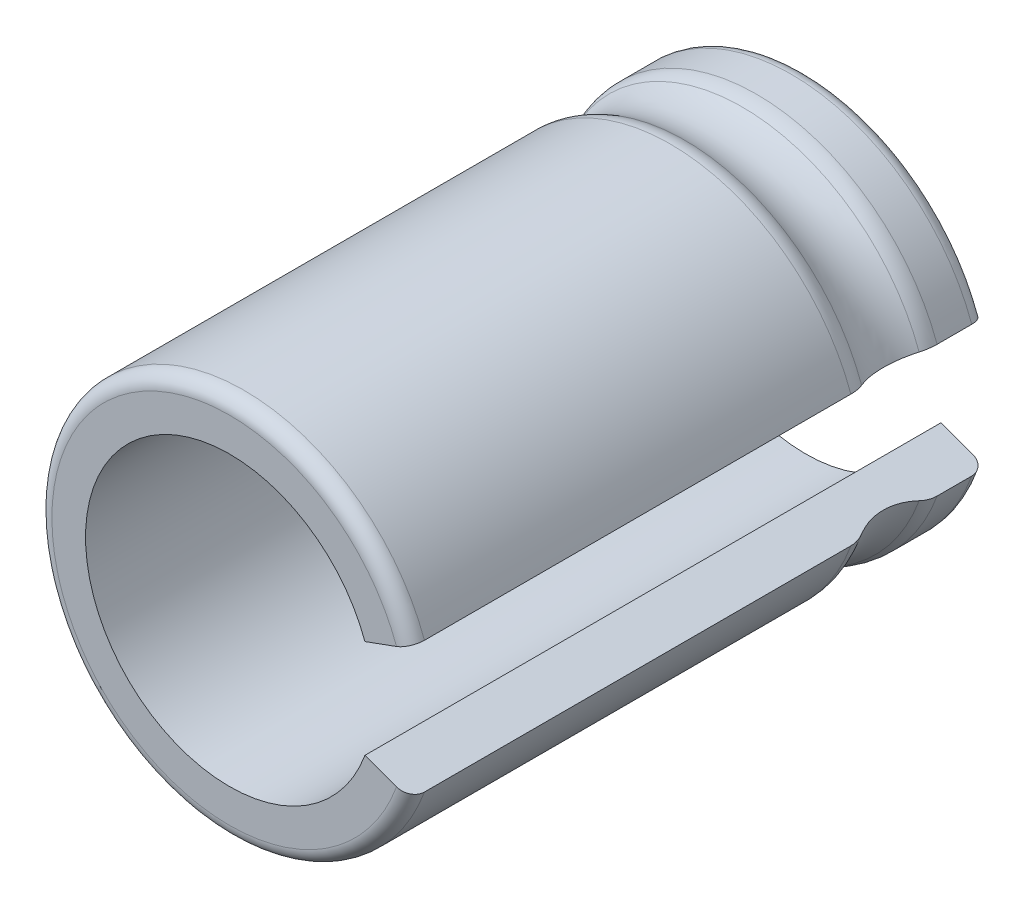
ISO-10303-21;
HEADER;
FILE_DESCRIPTION(('STEP AP214'),'2;1');
FILE_NAME('part.step','',(''),(''),'','','');
FILE_SCHEMA(('AUTOMOTIVE_DESIGN { 1 0 10303 214 1 1 1 1 }'));
ENDSEC;
DATA;
#1=APPLICATION_CONTEXT('core data for automotive mechanical design processes');
#2=APPLICATION_PROTOCOL_DEFINITION('international standard','automotive_design',2000,#1);
#3=PRODUCT_CONTEXT('',#1,'mechanical');
#4=PRODUCT('Part','Part','',(#3));
#5=PRODUCT_RELATED_PRODUCT_CATEGORY('part','',(#4));
#6=PRODUCT_DEFINITION_FORMATION('','',#4);
#7=PRODUCT_DEFINITION_CONTEXT('part definition',#1,'design');
#8=PRODUCT_DEFINITION('design','',#6,#7);
#9=PRODUCT_DEFINITION_SHAPE('','',#8);
#10=(LENGTH_UNIT() NAMED_UNIT(*) SI_UNIT(.MILLI.,.METRE.));
#11=(NAMED_UNIT(*) PLANE_ANGLE_UNIT() SI_UNIT($,.RADIAN.));
#12=(NAMED_UNIT(*) SI_UNIT($,.STERADIAN.) SOLID_ANGLE_UNIT());
#13=UNCERTAINTY_MEASURE_WITH_UNIT(LENGTH_MEASURE(1.E-05),#10,'distance_accuracy_value','');
#14=(GEOMETRIC_REPRESENTATION_CONTEXT(3) GLOBAL_UNCERTAINTY_ASSIGNED_CONTEXT((#13)) GLOBAL_UNIT_ASSIGNED_CONTEXT((#10,
#11,#12)) REPRESENTATION_CONTEXT('',''));
#15=CARTESIAN_POINT('',(0.,0.,0.));
#16=DIRECTION('',(0.,0.,1.));
#17=DIRECTION('',(1.,0.,0.));
#18=AXIS2_PLACEMENT_3D('',#15,#16,#17);
#19=CARTESIAN_POINT('',(-7.57206797263876E-13,0.,-3.45692956765));
#20=DIRECTION('',(0.,0.,1.));
#21=DIRECTION('',(1.,0.,0.));
#22=AXIS2_PLACEMENT_3D('',#19,#20,#21);
#23=TOROIDAL_SURFACE('',#22,3.39999999999777,0.600000000003147);
#24=CARTESIAN_POINT('',(0.,-2.93493528091826E-13,-3.157596976708));
#25=DIRECTION('',(0.,0.,-1.));
#26=DIRECTION('',(-1.,0.,0.));
#27=AXIS2_PLACEMENT_3D('',#24,#25,#26);
#28=CIRCLE('',#27,3.92000000000025);
#29=CARTESIAN_POINT('',(3.68359507348078,-1.34071896183729,-3.15759697670743));
#30=VERTEX_POINT('',#29);
#31=CARTESIAN_POINT('',(3.68359507348068,1.34071896183725,-3.1575969767075));
#32=VERTEX_POINT('',#31);
#33=EDGE_CURVE('E91',#30,#32,#28,.T.);
#34=ORIENTED_EDGE('',*,*,#33,.T.);
#35=CARTESIAN_POINT('',(3.19495491066913,1.1628684873068,-3.45692956765));
#36=DIRECTION('',(0.342020143325753,-0.939692620785878,0.));
#37=DIRECTION('',(0.939692620785878,0.342020143325753,0.));
#38=AXIS2_PLACEMENT_3D('',#35,#36,#37);
#39=CIRCLE('',#38,0.600000000003147);
#40=CARTESIAN_POINT('',(3.75877048314355,1.36808057330307,-3.45692956765));
#41=VERTEX_POINT('',#40);
#42=EDGE_CURVE('E21',#32,#41,#39,.F.);
#43=ORIENTED_EDGE('',*,*,#42,.T.);
#44=CARTESIAN_POINT('',(0.,0.,-3.45692956765));
#45=DIRECTION('',(0.,0.,1.));
#46=DIRECTION('',(1.,0.,0.));
#47=AXIS2_PLACEMENT_3D('',#44,#45,#46);
#48=CIRCLE('',#47,4.);
#49=CARTESIAN_POINT('',(3.75877048314354,-1.36808057330307,-3.45692956765));
#50=VERTEX_POINT('',#49);
#51=EDGE_CURVE('E143',#50,#41,#48,.F.);
#52=ORIENTED_EDGE('',*,*,#51,.F.);
#53=CARTESIAN_POINT('',(3.19495491066913,-1.16286848730681,-3.45692956765));
#54=DIRECTION('',(-0.342020143325757,-0.939692620785876,0.));
#55=DIRECTION('',(0.939692620785876,-0.342020143325757,0.));
#56=AXIS2_PLACEMENT_3D('',#53,#54,#55);
#57=CIRCLE('',#56,0.600000000003147);
#58=EDGE_CURVE('E97',#50,#30,#57,.T.);
#59=ORIENTED_EDGE('',*,*,#58,.T.);
#60=EDGE_LOOP('',(#34,#43,#52,#59));
#61=FACE_BOUND('',#60,.T.);
#62=ADVANCED_FACE('F17',(#61),#23,.T.);
#63=CARTESIAN_POINT('',(0.,-2.93601948309075E-13,-2.5589317948245));
#64=DIRECTION('',(0.,0.,1.));
#65=DIRECTION('',(1.,0.,0.));
#66=AXIS2_PLACEMENT_3D('',#63,#64,#65);
#67=TOROIDAL_SURFACE('',#66,4.95999999999899,1.19999999999874);
#68=ORIENTED_EDGE('',*,*,#33,.F.);
#69=CARTESIAN_POINT('',(4.66087539909701,-1.69641991089566,-2.5589317948245));
#70=DIRECTION('',(-0.342020143325749,-0.939692620785879,0.));
#71=DIRECTION('',(0.939692620785879,-0.342020143325749,0.));
#72=AXIS2_PLACEMENT_3D('',#69,#70,#71);
#73=CIRCLE('',#72,1.19999999999874);
#74=CARTESIAN_POINT('',(3.68359507348047,-1.34071896183716,-1.9602666129415));
#75=VERTEX_POINT('',#74);
#76=EDGE_CURVE('E101',#75,#30,#73,.T.);
#77=ORIENTED_EDGE('',*,*,#76,.F.);
#78=CARTESIAN_POINT('',(-7.57206797263876E-13,0.,-1.960266612941));
#79=DIRECTION('',(0.,0.,1.));
#80=DIRECTION('',(1.,0.,0.));
#81=AXIS2_PLACEMENT_3D('',#78,#79,#80);
#82=CIRCLE('',#81,3.92000000000015);
#83=CARTESIAN_POINT('',(3.6835950734805,1.34071896183718,-1.96026661294157));
#84=VERTEX_POINT('',#83);
#85=EDGE_CURVE('E107',#84,#75,#82,.T.);
#86=ORIENTED_EDGE('',*,*,#85,.F.);
#87=CARTESIAN_POINT('',(4.66087539909699,1.69641991089573,-2.5589317948245));
#88=DIRECTION('',(0.342020143325815,-0.939692620785855,0.));
#89=DIRECTION('',(0.939692620785855,0.342020143325815,0.));
#90=AXIS2_PLACEMENT_3D('',#87,#88,#89);
#91=CIRCLE('',#90,1.19999999999874);
#92=EDGE_CURVE('E104',#32,#84,#91,.F.);
#93=ORIENTED_EDGE('',*,*,#92,.F.);
#94=EDGE_LOOP('',(#68,#77,#86,#93));
#95=FACE_BOUND('',#94,.T.);
#96=ADVANCED_FACE('F105',(#95),#67,.F.);
#97=CARTESIAN_POINT('',(0.,0.,-3.878931794825));
#98=DIRECTION('',(0.,0.,1.));
#99=DIRECTION('',(1.,0.,0.));
#100=AXIS2_PLACEMENT_3D('',#97,#98,#99);
#101=CYLINDRICAL_SURFACE('',#100,4.);
#102=ORIENTED_EDGE('',*,*,#51,.T.);
#103=DIRECTION('',(0.,0.,1.));
#104=VECTOR('',#103,1.);
#105=CARTESIAN_POINT('',(3.75877048314357,1.36808057330284,-3.878931794825));
#106=LINE('',#105,#104);
#107=CARTESIAN_POINT('',(3.75877048314354,1.36808057330307,-4.178931794825));
#108=VERTEX_POINT('',#107);
#109=EDGE_CURVE('E114',#41,#108,#106,.F.);
#110=ORIENTED_EDGE('',*,*,#109,.T.);
#111=CARTESIAN_POINT('',(-3.59304599961696E-13,0.,-4.178931794825));
#112=DIRECTION('',(0.,0.,-1.));
#113=DIRECTION('',(0.,1.,0.));
#114=AXIS2_PLACEMENT_3D('',#111,#112,#113);
#115=CIRCLE('',#114,4.00000000000022);
#116=CARTESIAN_POINT('',(3.75877048314354,-1.36808057330305,-4.178931794825));
#117=VERTEX_POINT('',#116);
#118=EDGE_CURVE('E123',#117,#108,#115,.T.);
#119=ORIENTED_EDGE('',*,*,#118,.F.);
#120=DIRECTION('',(0.,0.,1.));
#121=VECTOR('',#120,1.);
#122=CARTESIAN_POINT('',(3.75877048314357,-1.36808057330284,-3.878931794825));
#123=LINE('',#122,#121);
#124=EDGE_CURVE('E100',#117,#50,#123,.T.);
#125=ORIENTED_EDGE('',*,*,#124,.T.);
#126=EDGE_LOOP('',(#102,#110,#119,#125));
#127=FACE_BOUND('',#126,.T.);
#128=ADVANCED_FACE('F185',(#127),#101,.T.);
#129=CARTESIAN_POINT('',(-3.5301622736128E-13,0.,-1.660934021999));
#130=DIRECTION('',(0.,0.,1.));
#131=DIRECTION('',(1.,0.,0.));
#132=AXIS2_PLACEMENT_3D('',#129,#130,#131);
#133=TOROIDAL_SURFACE('',#132,3.39999999999739,0.600000000003146);
#134=CARTESIAN_POINT('',(3.19495491066914,-1.16286848730678,-1.660934021999));
#135=DIRECTION('',(-0.342020143325786,-0.939692620785866,0.));
#136=DIRECTION('',(0.939692620785866,-0.342020143325786,0.));
#137=AXIS2_PLACEMENT_3D('',#134,#135,#136);
#138=CIRCLE('',#137,0.600000000003146);
#139=CARTESIAN_POINT('',(3.75877048314368,-1.36808057330336,-1.660934021999));
#140=VERTEX_POINT('',#139);
#141=EDGE_CURVE('E119',#75,#140,#138,.T.);
#142=ORIENTED_EDGE('',*,*,#141,.T.);
#143=CARTESIAN_POINT('',(0.,0.,-1.660934021999));
#144=DIRECTION('',(0.,0.,1.));
#145=DIRECTION('',(1.,0.,0.));
#146=AXIS2_PLACEMENT_3D('',#143,#144,#145);
#147=CIRCLE('',#146,4.);
#148=CARTESIAN_POINT('',(3.75877048314368,1.36808057330336,-1.660934021999));
#149=VERTEX_POINT('',#148);
#150=EDGE_CURVE('E152',#149,#140,#147,.T.);
#151=ORIENTED_EDGE('',*,*,#150,.F.);
#152=CARTESIAN_POINT('',(3.19495491066914,1.16286848730679,-1.660934021999));
#153=DIRECTION('',(0.342020143325789,-0.939692620785865,0.));
#154=DIRECTION('',(0.939692620785865,0.342020143325789,0.));
#155=AXIS2_PLACEMENT_3D('',#152,#153,#154);
#156=CIRCLE('',#155,0.600000000003146);
#157=EDGE_CURVE('E117',#149,#84,#156,.F.);
#158=ORIENTED_EDGE('',*,*,#157,.T.);
#159=ORIENTED_EDGE('',*,*,#85,.T.);
#160=EDGE_LOOP('',(#142,#151,#158,#159));
#161=FACE_BOUND('',#160,.T.);
#162=ADVANCED_FACE('F188',(#161),#133,.T.);
#163=CARTESIAN_POINT('',(-3.59087759527199E-13,0.,-4.178931794825));
#164=DIRECTION('',(0.,0.,1.));
#165=DIRECTION('',(0.,-1.,0.));
#166=AXIS2_PLACEMENT_3D('',#163,#164,#165);
#167=TOROIDAL_SURFACE('',#166,3.70000000000048,0.300000000000159);
#168=CARTESIAN_POINT('',(3.4768626969078,-1.26547453030554,-4.178931794825));
#169=DIRECTION('',(-0.342020143325777,-0.939692620785869,0.));
#170=DIRECTION('',(0.939692620785869,-0.342020143325777,0.));
#171=AXIS2_PLACEMENT_3D('',#168,#169,#170);
#172=CIRCLE('',#171,0.300000000000159);
#173=CARTESIAN_POINT('',(3.4768626969079,-1.26547453030527,-4.478931794825));
#174=VERTEX_POINT('',#173);
#175=EDGE_CURVE('E121',#174,#117,#172,.T.);
#176=ORIENTED_EDGE('',*,*,#175,.T.);
#177=ORIENTED_EDGE('',*,*,#118,.T.);
#178=CARTESIAN_POINT('',(3.47686269690779,1.26547453030558,-4.178931794825));
#179=DIRECTION('',(0.342020143325788,-0.939692620785865,0.));
#180=DIRECTION('',(0.939692620785865,0.342020143325788,0.));
#181=AXIS2_PLACEMENT_3D('',#178,#179,#180);
#182=CIRCLE('',#181,0.300000000000159);
#183=CARTESIAN_POINT('',(3.47686269690789,1.26547453030529,-4.478931794825));
#184=VERTEX_POINT('',#183);
#185=EDGE_CURVE('E124',#108,#184,#182,.F.);
#186=ORIENTED_EDGE('',*,*,#185,.T.);
#187=CARTESIAN_POINT('',(3.476862696908,-1.265474530305,-4.478931794825));
#188=CARTESIAN_POINT('',(3.26103856737503,-1.85844645277061,-4.478931794825));
#189=CARTESIAN_POINT('',(2.86027016297859,-2.34709492666424,-4.478931794825));
#190=CARTESIAN_POINT('',(2.43389206497986,-2.86696876053724,-4.478931794825));
#191=CARTESIAN_POINT('',(1.85000000000033,-3.20429399400233,-4.478931794825));
#192=CARTESIAN_POINT('',(1.26787249486133,-3.54059980864695,-4.478931794825));
#193=CARTESIAN_POINT('',(0.602508750095118,-3.65061408615888,-4.478931794825));
#194=CARTESIAN_POINT('',(-0.0194935306930526,-3.753458781365,-4.478931794825));
#195=CARTESIAN_POINT('',(-0.642498257367666,-3.643788686145,-4.478931794825));
#196=CARTESIAN_POINT('',(-1.26346814906657,-3.53447679133021,-4.478931794825));
#197=CARTESIAN_POINT('',(-1.81475657939829,-3.22438498903724,-4.478931794825));
#198=CARTESIAN_POINT('',(-2.40077214272614,-2.89475967458121,-4.478931794825));
#199=CARTESIAN_POINT('',(-2.83436443954033,-2.37831415584033,-4.478931794825));
#200=CARTESIAN_POINT('',(-3.26664639362101,-1.86342936739313,-4.478931794825));
#201=CARTESIAN_POINT('',(-3.49052850882235,-1.22727777177847,-4.478931794825));
#202=CARTESIAN_POINT('',(-3.69982032457998,-0.632583897175916,-4.478931794825));
#203=CARTESIAN_POINT('',(-3.7,0.,-4.478931794825));
#204=CARTESIAN_POINT('',(-3.70017908857082,0.630517775060658,-4.478931794825));
#205=CARTESIAN_POINT('',(-3.49052850882176,1.22727777177782,-4.478931794825));
#206=CARTESIAN_POINT('',(-3.26767147821267,1.8616292770962,-4.478931794825));
#207=CARTESIAN_POINT('',(-2.83436443954033,2.37831415584033,-4.478931794825));
#208=CARTESIAN_POINT('',(-2.40236688153895,2.89343758092389,-4.478931794825));
#209=CARTESIAN_POINT('',(-1.81475657939818,3.22438498903806,-4.478931794825));
#210=CARTESIAN_POINT('',(-1.26544058343064,3.53376469943251,-4.478931794825));
#211=CARTESIAN_POINT('',(-0.642498257368,3.643788686145,-4.478931794825));
#212=CARTESIAN_POINT('',(-0.0215905624733059,3.75345331658449,-4.478931794825));
#213=CARTESIAN_POINT('',(0.602508750095059,3.65061408615882,-4.478931794825));
#214=CARTESIAN_POINT('',(1.26592174791691,3.54129673749901,-4.478931794825));
#215=CARTESIAN_POINT('',(1.85,3.20429399400267,-4.478931794825));
#216=CARTESIAN_POINT('',(2.43231324228172,2.8683096297102,-4.478931794825));
#217=CARTESIAN_POINT('',(2.860270162979,2.347094926664,-4.478931794825));
#218=CARTESIAN_POINT('',(3.26068092017614,1.85942908037047,-4.478931794825));
#219=CARTESIAN_POINT('',(3.476862696908,1.265474530305,-4.478931794825));
#220=B_SPLINE_CURVE_WITH_KNOTS('',2,(#187,#188,#189,#190,#191,#192,#193,#194,#195,#196,#197,
#198,#199,#200,#201,#202,#203,#204,#205,#206,#207,#208,#209,#210,#211,#212,#213,#214,#215,#216,
#217,#218,#219),.UNSPECIFIED.,.F.,.F.,(3,2,2,2,2,2,2,2,2,2,2,2,2,2,2,2,3),(0.,0.0625,0.125,
0.1875,0.25,0.3125,0.375,0.4375,0.5,0.5625,0.625,0.6875,0.75,0.8125,0.875,0.9375,1.),.UNSPECIFIED.);
#221=EDGE_CURVE('E158',#174,#184,#220,.T.);
#222=ORIENTED_EDGE('',*,*,#221,.F.);
#223=EDGE_LOOP('',(#176,#177,#186,#222));
#224=FACE_BOUND('',#223,.T.);
#225=ADVANCED_FACE('F183',(#224),#167,.T.);
#226=CARTESIAN_POINT('',(0.,0.,2.841068205175));
#227=DIRECTION('',(0.,0.,1.));
#228=DIRECTION('',(1.,0.,0.));
#229=AXIS2_PLACEMENT_3D('',#226,#227,#228);
#230=CYLINDRICAL_SURFACE('',#229,4.);
#231=ORIENTED_EDGE('',*,*,#150,.T.);
#232=DIRECTION('',(0.,0.,1.));
#233=VECTOR('',#232,1.);
#234=CARTESIAN_POINT('',(3.75877048314385,-1.36808057330342,1.56575730857));
#235=LINE('',#234,#233);
#236=CARTESIAN_POINT('',(3.75877048314367,-1.36808057330336,7.221068205175));
#237=VERTEX_POINT('',#236);
#238=EDGE_CURVE('E135',#237,#140,#235,.F.);
#239=ORIENTED_EDGE('',*,*,#238,.F.);
#240=CARTESIAN_POINT('',(-3.5301622736128E-13,0.,7.221068205175));
#241=DIRECTION('',(0.,0.,1.));
#242=DIRECTION('',(0.,-1.,0.));
#243=AXIS2_PLACEMENT_3D('',#240,#241,#242);
#244=CIRCLE('',#243,4.00000000000022);
#245=CARTESIAN_POINT('',(3.75877048314368,1.36808057330335,7.221068205175));
#246=VERTEX_POINT('',#245);
#247=EDGE_CURVE('E128',#246,#237,#244,.T.);
#248=ORIENTED_EDGE('',*,*,#247,.F.);
#249=DIRECTION('',(0.,0.,1.));
#250=VECTOR('',#249,1.);
#251=CARTESIAN_POINT('',(3.75877048314385,1.36808057330342,1.56575730857));
#252=LINE('',#251,#250);
#253=EDGE_CURVE('E131',#246,#149,#252,.F.);
#254=ORIENTED_EDGE('',*,*,#253,.T.);
#255=EDGE_LOOP('',(#231,#239,#248,#254));
#256=FACE_BOUND('',#255,.T.);
#257=ADVANCED_FACE('F180',(#256),#230,.T.);
#258=CARTESIAN_POINT('',(1.07986536379556E-13,0.,7.221068205175));
#259=DIRECTION('',(0.,0.,1.));
#260=DIRECTION('',(1.,0.,0.));
#261=AXIS2_PLACEMENT_3D('',#258,#259,#260);
#262=TOROIDAL_SURFACE('',#261,3.70000000000004,0.300000000000158);
#263=CARTESIAN_POINT('',(3.47686269690779,-1.26547453030557,7.221068205175));
#264=DIRECTION('',(-0.342020143325826,-0.939692620785851,0.));
#265=DIRECTION('',(0.939692620785851,-0.342020143325826,0.));
#266=AXIS2_PLACEMENT_3D('',#263,#264,#265);
#267=CIRCLE('',#266,0.300000000000158);
#268=CARTESIAN_POINT('',(3.4768626969079,-1.26547453030528,7.521068205175));
#269=VERTEX_POINT('',#268);
#270=EDGE_CURVE('E132',#269,#237,#267,.F.);
#271=ORIENTED_EDGE('',*,*,#270,.F.);
#272=CARTESIAN_POINT('',(3.476862696908,1.265474530305,7.521068205175));
#273=CARTESIAN_POINT('',(3.26103856737466,1.85844645277164,7.521068205175));
#274=CARTESIAN_POINT('',(2.86027016297865,2.34709492666418,7.521068205175));
#275=CARTESIAN_POINT('',(2.43389206498112,2.86696876053512,7.521068205175));
#276=CARTESIAN_POINT('',(1.85,3.204293994002,7.521068205175));
#277=CARTESIAN_POINT('',(1.26787249486422,3.54059980864562,7.521068205175));
#278=CARTESIAN_POINT('',(0.602508750095118,3.65061408615888,7.521068205175));
#279=CARTESIAN_POINT('',(-0.0194935306901019,3.75345878136531,7.521068205175));
#280=CARTESIAN_POINT('',(-0.642498257368,3.643788686145,7.521068205175));
#281=CARTESIAN_POINT('',(-1.26346814906661,3.53447679133053,7.521068205175));
#282=CARTESIAN_POINT('',(-1.81475657939835,3.22438498903718,7.521068205175));
#283=CARTESIAN_POINT('',(-2.40077214272651,2.89475967458059,7.521068205175));
#284=CARTESIAN_POINT('',(-2.83436443954033,2.37831415584033,7.521068205175));
#285=CARTESIAN_POINT('',(-3.26664639362038,1.86342936739406,7.521068205175));
#286=CARTESIAN_POINT('',(-3.49052850882235,1.22727777177853,7.521068205175));
#287=CARTESIAN_POINT('',(-3.69982032457894,0.632583897179767,7.521068205175));
#288=CARTESIAN_POINT('',(-3.7,0.,7.521068205175));
#289=CARTESIAN_POINT('',(-3.70017908857185,-0.630517775055177,7.521068205175));
#290=CARTESIAN_POINT('',(-3.49052850882176,-1.22727777177794,7.521068205175));
#291=CARTESIAN_POINT('',(-3.26767147821312,-1.86162927709786,7.521068205175));
#292=CARTESIAN_POINT('',(-2.83436443954067,-2.37831415584033,7.521068205175));
#293=CARTESIAN_POINT('',(-2.40236688153648,-2.89343758092543,7.521068205175));
#294=CARTESIAN_POINT('',(-1.81475657939812,-3.22438498903806,7.521068205175));
#295=CARTESIAN_POINT('',(-1.26544058343089,-3.53376469943217,7.521068205175));
#296=CARTESIAN_POINT('',(-0.642498257367667,-3.643788686145,7.521068205175));
#297=CARTESIAN_POINT('',(-0.0215905624753069,-3.75345331658432,7.521068205175));
#298=CARTESIAN_POINT('',(0.602508750095059,-3.65061408615882,7.521068205175));
#299=CARTESIAN_POINT('',(1.26592174791674,-3.54129673749957,7.521068205175));
#300=CARTESIAN_POINT('',(1.85,-3.204293994002,7.521068205175));
#301=CARTESIAN_POINT('',(2.432313242286,-2.86830962970594,7.521068205175));
#302=CARTESIAN_POINT('',(2.86027016297906,-2.34709492666394,7.521068205175));
#303=CARTESIAN_POINT('',(3.2606809201794,-1.85942908036563,7.521068205175));
#304=CARTESIAN_POINT('',(3.476862696908,-1.265474530305,7.521068205175));
#305=B_SPLINE_CURVE_WITH_KNOTS('',2,(#272,#273,#274,#275,#276,#277,#278,#279,#280,#281,#282,
#283,#284,#285,#286,#287,#288,#289,#290,#291,#292,#293,#294,#295,#296,#297,#298,#299,#300,#301,
#302,#303,#304),.UNSPECIFIED.,.F.,.F.,(3,2,2,2,2,2,2,2,2,2,2,2,2,2,2,2,3),(0.,0.0625,0.125,
0.1875,0.25,0.3125,0.375,0.4375,0.5,0.5625,0.625,0.6875,0.75,0.8125,0.875,0.9375,1.),.UNSPECIFIED.);
#306=CARTESIAN_POINT('',(3.4768626969079,1.26547453030527,7.521068205175));
#307=VERTEX_POINT('',#306);
#308=EDGE_CURVE('E212',#307,#269,#305,.T.);
#309=ORIENTED_EDGE('',*,*,#308,.F.);
#310=CARTESIAN_POINT('',(3.47686269690781,1.26547453030554,7.221068205175));
#311=DIRECTION('',(0.342020143325817,-0.939692620785854,0.));
#312=DIRECTION('',(0.939692620785854,0.342020143325817,0.));
#313=AXIS2_PLACEMENT_3D('',#310,#311,#312);
#314=CIRCLE('',#313,0.300000000000158);
#315=EDGE_CURVE('E127',#307,#246,#314,.F.);
#316=ORIENTED_EDGE('',*,*,#315,.T.);
#317=ORIENTED_EDGE('',*,*,#247,.T.);
#318=EDGE_LOOP('',(#271,#309,#316,#317));
#319=FACE_BOUND('',#318,.T.);
#320=ADVANCED_FACE('F19',(#319),#262,.T.);
#321=CARTESIAN_POINT('',(3.27705377409,1.192750029859,1.56575730857));
#322=DIRECTION('',(-0.342020143325932,0.939692620785813,0.));
#323=DIRECTION('',(-0.939692620785813,-0.342020143325932,0.));
#324=AXIS2_PLACEMENT_3D('',#321,#322,#323);
#325=PLANE('',#324);
#326=ORIENTED_EDGE('',*,*,#157,.F.);
#327=ORIENTED_EDGE('',*,*,#253,.F.);
#328=ORIENTED_EDGE('',*,*,#315,.F.);
#329=DIRECTION('',(0.939692620785871,0.342020143325771,0.));
#330=VECTOR('',#329,1.);
#331=CARTESIAN_POINT('',(2.819077862358,1.026060429977,7.521068205175));
#332=LINE('',#331,#330);
#333=CARTESIAN_POINT('',(2.81907786235776,1.02606042997691,7.521068205175));
#334=VERTEX_POINT('',#333);
#335=EDGE_CURVE('E215',#334,#307,#332,.T.);
#336=ORIENTED_EDGE('',*,*,#335,.F.);
#337=DIRECTION('',(0.,0.,1.));
#338=VECTOR('',#337,1.);
#339=CARTESIAN_POINT('',(2.81907786235776,1.02606042997691,1.521068205175));
#340=LINE('',#339,#338);
#341=CARTESIAN_POINT('',(2.81907786235776,1.02606042997691,-4.478931794825));
#342=VERTEX_POINT('',#341);
#343=EDGE_CURVE('E139',#334,#342,#340,.F.);
#344=ORIENTED_EDGE('',*,*,#343,.T.);
#345=DIRECTION('',(-0.939692620785871,-0.342020143325771,0.));
#346=VECTOR('',#345,1.);
#347=CARTESIAN_POINT('',(3.476862696908,1.265474530305,-4.478931794825));
#348=LINE('',#347,#346);
#349=EDGE_CURVE('E159',#184,#342,#348,.T.);
#350=ORIENTED_EDGE('',*,*,#349,.F.);
#351=ORIENTED_EDGE('',*,*,#185,.F.);
#352=ORIENTED_EDGE('',*,*,#109,.F.);
#353=ORIENTED_EDGE('',*,*,#42,.F.);
#354=ORIENTED_EDGE('',*,*,#92,.T.);
#355=EDGE_LOOP('',(#326,#327,#328,#336,#344,#350,#351,#352,#353,#354));
#356=FACE_BOUND('',#355,.T.);
#357=ADVANCED_FACE('F112',(#356),#325,.F.);
#358=CARTESIAN_POINT('',(3.758770483144,1.368080573303,-4.478931794825));
#359=DIRECTION('',(0.,0.,-1.));
#360=DIRECTION('',(-1.,0.,0.));
#361=AXIS2_PLACEMENT_3D('',#358,#359,#360);
#362=PLANE('',#361);
#363=ORIENTED_EDGE('',*,*,#221,.T.);
#364=ORIENTED_EDGE('',*,*,#349,.T.);
#365=CARTESIAN_POINT('',(0.,0.,-4.478931794825));
#366=DIRECTION('',(0.,0.,1.));
#367=DIRECTION('',(1.,0.,0.));
#368=AXIS2_PLACEMENT_3D('',#365,#366,#367);
#369=CIRCLE('',#368,3.);
#370=CARTESIAN_POINT('',(2.81907786235768,-1.02606042997713,-4.478931794825));
#371=VERTEX_POINT('',#370);
#372=EDGE_CURVE('E137',#342,#371,#369,.T.);
#373=ORIENTED_EDGE('',*,*,#372,.T.);
#374=DIRECTION('',(-0.939692620785813,0.342020143325932,0.));
#375=VECTOR('',#374,1.);
#376=CARTESIAN_POINT('',(3.27705377409,-1.192750029859,-4.478931794825));
#377=LINE('',#376,#375);
#378=EDGE_CURVE('E136',#174,#371,#377,.T.);
#379=ORIENTED_EDGE('',*,*,#378,.F.);
#380=EDGE_LOOP('',(#363,#364,#373,#379));
#381=FACE_BOUND('',#380,.T.);
#382=ADVANCED_FACE('F165',(#381),#362,.T.);
#383=CARTESIAN_POINT('',(3.27705377409,-1.192750029859,1.56575730857));
#384=DIRECTION('',(0.342020143325932,0.939692620785813,0.));
#385=DIRECTION('',(-0.939692620785813,0.342020143325932,0.));
#386=AXIS2_PLACEMENT_3D('',#383,#384,#385);
#387=PLANE('',#386);
#388=ORIENTED_EDGE('',*,*,#270,.T.);
#389=ORIENTED_EDGE('',*,*,#238,.T.);
#390=ORIENTED_EDGE('',*,*,#141,.F.);
#391=ORIENTED_EDGE('',*,*,#76,.T.);
#392=ORIENTED_EDGE('',*,*,#58,.F.);
#393=ORIENTED_EDGE('',*,*,#124,.F.);
#394=ORIENTED_EDGE('',*,*,#175,.F.);
#395=ORIENTED_EDGE('',*,*,#378,.T.);
#396=DIRECTION('',(0.,0.,1.));
#397=VECTOR('',#396,1.);
#398=CARTESIAN_POINT('',(2.81907786235776,-1.02606042997691,1.521068205175));
#399=LINE('',#398,#397);
#400=CARTESIAN_POINT('',(2.81907786235776,-1.02606042997691,7.521068205175));
#401=VERTEX_POINT('',#400);
#402=EDGE_CURVE('E27',#371,#401,#399,.T.);
#403=ORIENTED_EDGE('',*,*,#402,.T.);
#404=DIRECTION('',(-0.939692620785871,0.342020143325772,0.));
#405=VECTOR('',#404,1.);
#406=CARTESIAN_POINT('',(3.476862696908,-1.265474530305,7.521068205175));
#407=LINE('',#406,#405);
#408=EDGE_CURVE('E35',#269,#401,#407,.T.);
#409=ORIENTED_EDGE('',*,*,#408,.F.);
#410=EDGE_LOOP('',(#388,#389,#390,#391,#392,#393,#394,#395,#403,#409));
#411=FACE_BOUND('',#410,.T.);
#412=ADVANCED_FACE('F175',(#411),#387,.T.);
#413=CARTESIAN_POINT('',(2.819077862358,1.026060429977,7.521068205175));
#414=DIRECTION('',(0.,0.,1.));
#415=DIRECTION('',(1.,0.,0.));
#416=AXIS2_PLACEMENT_3D('',#413,#414,#415);
#417=PLANE('',#416);
#418=ORIENTED_EDGE('',*,*,#308,.T.);
#419=ORIENTED_EDGE('',*,*,#408,.T.);
#420=CARTESIAN_POINT('',(0.,0.,7.521068205175));
#421=DIRECTION('',(0.,0.,1.));
#422=DIRECTION('',(1.,0.,0.));
#423=AXIS2_PLACEMENT_3D('',#420,#421,#422);
#424=CIRCLE('',#423,3.);
#425=EDGE_CURVE('E11',#401,#334,#424,.F.);
#426=ORIENTED_EDGE('',*,*,#425,.T.);
#427=ORIENTED_EDGE('',*,*,#335,.T.);
#428=EDGE_LOOP('',(#418,#419,#426,#427));
#429=FACE_BOUND('',#428,.T.);
#430=ADVANCED_FACE('F203',(#429),#417,.T.);
#431=CARTESIAN_POINT('',(0.,0.,1.521068205175));
#432=DIRECTION('',(0.,0.,1.));
#433=DIRECTION('',(1.,0.,0.));
#434=AXIS2_PLACEMENT_3D('',#431,#432,#433);
#435=CYLINDRICAL_SURFACE('',#434,3.);
#436=ORIENTED_EDGE('',*,*,#402,.F.);
#437=ORIENTED_EDGE('',*,*,#372,.F.);
#438=ORIENTED_EDGE('',*,*,#343,.F.);
#439=ORIENTED_EDGE('',*,*,#425,.F.);
#440=EDGE_LOOP('',(#436,#437,#438,#439));
#441=FACE_BOUND('',#440,.T.);
#442=ADVANCED_FACE('F201',(#441),#435,.F.);
#443=CLOSED_SHELL('',(#62,#96,#128,#162,#225,#257,#320,#357,#382,#412,#430,#442));
#444=MANIFOLD_SOLID_BREP('B1',#443);
#445=ADVANCED_BREP_SHAPE_REPRESENTATION('',(#18,#444),#14);
#446=SHAPE_DEFINITION_REPRESENTATION(#9,#445);
ENDSEC;
END-ISO-10303-21;
